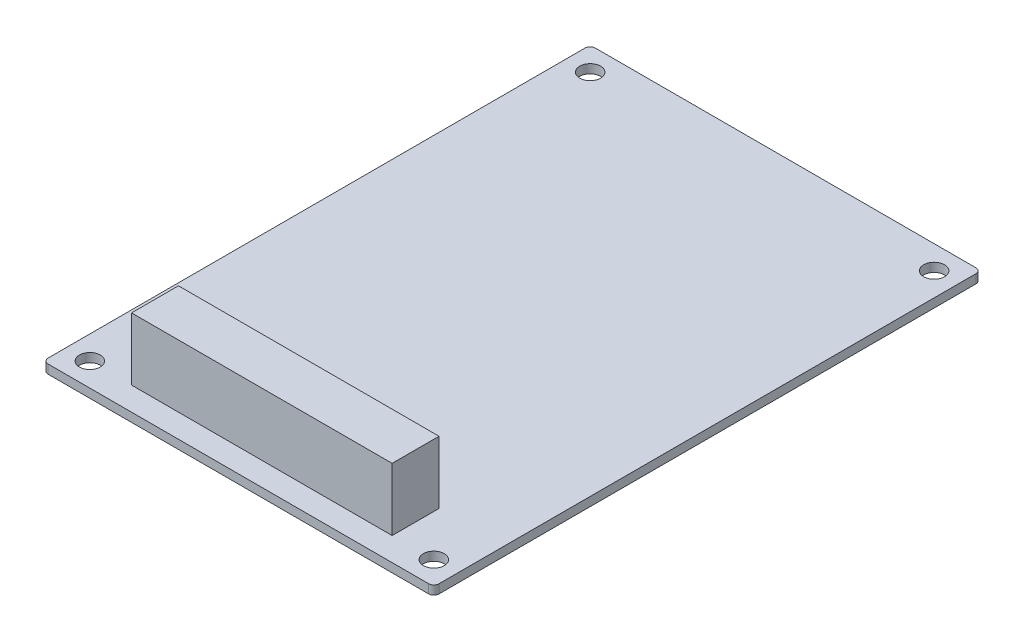
ISO-10303-21;
HEADER;
FILE_DESCRIPTION(('STEP AP214'),'2;1');
FILE_NAME('part.step','',(''),(''),'','','');
FILE_SCHEMA(('AUTOMOTIVE_DESIGN { 1 0 10303 214 1 1 1 1 }'));
ENDSEC;
DATA;
#1=APPLICATION_CONTEXT('core data for automotive mechanical design processes');
#2=APPLICATION_PROTOCOL_DEFINITION('international standard','automotive_design',2000,#1);
#3=PRODUCT_CONTEXT('',#1,'mechanical');
#4=PRODUCT('Part','Part','',(#3));
#5=PRODUCT_RELATED_PRODUCT_CATEGORY('part','',(#4));
#6=PRODUCT_DEFINITION_FORMATION('','',#4);
#7=PRODUCT_DEFINITION_CONTEXT('part definition',#1,'design');
#8=PRODUCT_DEFINITION('design','',#6,#7);
#9=PRODUCT_DEFINITION_SHAPE('','',#8);
#10=(LENGTH_UNIT() NAMED_UNIT(*) SI_UNIT(.MILLI.,.METRE.));
#11=(NAMED_UNIT(*) PLANE_ANGLE_UNIT() SI_UNIT($,.RADIAN.));
#12=(NAMED_UNIT(*) SI_UNIT($,.STERADIAN.) SOLID_ANGLE_UNIT());
#13=UNCERTAINTY_MEASURE_WITH_UNIT(LENGTH_MEASURE(1.E-05),#10,'distance_accuracy_value','');
#14=(GEOMETRIC_REPRESENTATION_CONTEXT(3) GLOBAL_UNCERTAINTY_ASSIGNED_CONTEXT((#13)) GLOBAL_UNIT_ASSIGNED_CONTEXT((#10,
#11,#12)) REPRESENTATION_CONTEXT('',''));
#15=CARTESIAN_POINT('',(0.,0.,0.));
#16=DIRECTION('',(0.,0.,1.));
#17=DIRECTION('',(1.,0.,0.));
#18=AXIS2_PLACEMENT_3D('',#15,#16,#17);
#19=CARTESIAN_POINT('',(0.,1.7,0.));
#20=DIRECTION('',(1.,0.,0.));
#21=DIRECTION('',(0.,0.,-1.));
#22=AXIS2_PLACEMENT_3D('',#19,#20,#21);
#23=PLANE('',#22);
#24=DIRECTION('',(0.,0.,1.));
#25=VECTOR('',#24,1.);
#26=CARTESIAN_POINT('',(0.,1.7,0.));
#27=LINE('',#26,#25);
#28=CARTESIAN_POINT('',(0.,1.7,1.));
#29=VERTEX_POINT('',#28);
#30=CARTESIAN_POINT('',(0.,1.7,104.));
#31=VERTEX_POINT('',#30);
#32=EDGE_CURVE('E226',#29,#31,#27,.T.);
#33=ORIENTED_EDGE('',*,*,#32,.F.);
#34=DIRECTION('',(0.,-1.,0.));
#35=VECTOR('',#34,1.);
#36=CARTESIAN_POINT('',(0.,1.7,1.));
#37=LINE('',#36,#35);
#38=CARTESIAN_POINT('',(0.,0.,1.));
#39=VERTEX_POINT('',#38);
#40=EDGE_CURVE('E251',#29,#39,#37,.T.);
#41=ORIENTED_EDGE('',*,*,#40,.T.);
#42=DIRECTION('',(0.,0.,1.));
#43=VECTOR('',#42,1.);
#44=CARTESIAN_POINT('',(0.,0.,0.));
#45=LINE('',#44,#43);
#46=CARTESIAN_POINT('',(0.,0.,104.));
#47=VERTEX_POINT('',#46);
#48=EDGE_CURVE('E225',#39,#47,#45,.T.);
#49=ORIENTED_EDGE('',*,*,#48,.T.);
#50=DIRECTION('',(0.,-1.,0.));
#51=VECTOR('',#50,1.);
#52=CARTESIAN_POINT('',(0.,1.7,104.));
#53=LINE('',#52,#51);
#54=EDGE_CURVE('E239',#47,#31,#53,.F.);
#55=ORIENTED_EDGE('',*,*,#54,.T.);
#56=EDGE_LOOP('',(#33,#41,#49,#55));
#57=FACE_BOUND('',#56,.T.);
#58=ADVANCED_FACE('F33',(#57),#23,.F.);
#59=CARTESIAN_POINT('',(0.,1.7,105.));
#60=DIRECTION('',(0.,0.,-1.));
#61=DIRECTION('',(-1.,0.,0.));
#62=AXIS2_PLACEMENT_3D('',#59,#60,#61);
#63=PLANE('',#62);
#64=DIRECTION('',(1.,0.,0.));
#65=VECTOR('',#64,1.);
#66=CARTESIAN_POINT('',(0.,1.7,105.));
#67=LINE('',#66,#65);
#68=CARTESIAN_POINT('',(1.00000000000003,1.7,105.));
#69=VERTEX_POINT('',#68);
#70=CARTESIAN_POINT('',(74.,1.7,105.));
#71=VERTEX_POINT('',#70);
#72=EDGE_CURVE('E229',#69,#71,#67,.T.);
#73=ORIENTED_EDGE('',*,*,#72,.F.);
#74=DIRECTION('',(0.,-1.,0.));
#75=VECTOR('',#74,1.);
#76=CARTESIAN_POINT('',(1.00000000000003,1.7,105.));
#77=LINE('',#76,#75);
#78=CARTESIAN_POINT('',(1.00000000000003,0.,105.));
#79=VERTEX_POINT('',#78);
#80=EDGE_CURVE('E282',#69,#79,#77,.T.);
#81=ORIENTED_EDGE('',*,*,#80,.T.);
#82=DIRECTION('',(1.,0.,0.));
#83=VECTOR('',#82,1.);
#84=CARTESIAN_POINT('',(0.,0.,105.));
#85=LINE('',#84,#83);
#86=CARTESIAN_POINT('',(74.,0.,105.));
#87=VERTEX_POINT('',#86);
#88=EDGE_CURVE('E242',#79,#87,#85,.T.);
#89=ORIENTED_EDGE('',*,*,#88,.T.);
#90=DIRECTION('',(0.,-1.,0.));
#91=VECTOR('',#90,1.);
#92=CARTESIAN_POINT('',(74.,1.7,105.));
#93=LINE('',#92,#91);
#94=EDGE_CURVE('E280',#87,#71,#93,.F.);
#95=ORIENTED_EDGE('',*,*,#94,.T.);
#96=EDGE_LOOP('',(#73,#81,#89,#95));
#97=FACE_BOUND('',#96,.T.);
#98=ADVANCED_FACE('F321',(#97),#63,.F.);
#99=CARTESIAN_POINT('',(75.,1.7,0.));
#100=DIRECTION('',(-1.,0.,0.));
#101=DIRECTION('',(0.,0.,1.));
#102=AXIS2_PLACEMENT_3D('',#99,#100,#101);
#103=PLANE('',#102);
#104=DIRECTION('',(0.,0.,-1.));
#105=VECTOR('',#104,1.);
#106=CARTESIAN_POINT('',(75.,0.,0.));
#107=LINE('',#106,#105);
#108=CARTESIAN_POINT('',(75.,0.,104.));
#109=VERTEX_POINT('',#108);
#110=CARTESIAN_POINT('',(75.,0.,1.));
#111=VERTEX_POINT('',#110);
#112=EDGE_CURVE('E245',#109,#111,#107,.T.);
#113=ORIENTED_EDGE('',*,*,#112,.T.);
#114=DIRECTION('',(0.,-1.,0.));
#115=VECTOR('',#114,1.);
#116=CARTESIAN_POINT('',(75.,1.7,1.));
#117=LINE('',#116,#115);
#118=CARTESIAN_POINT('',(75.,1.7,1.));
#119=VERTEX_POINT('',#118);
#120=EDGE_CURVE('E278',#111,#119,#117,.F.);
#121=ORIENTED_EDGE('',*,*,#120,.T.);
#122=DIRECTION('',(0.,0.,-1.));
#123=VECTOR('',#122,1.);
#124=CARTESIAN_POINT('',(75.,1.7,0.));
#125=LINE('',#124,#123);
#126=CARTESIAN_POINT('',(75.,1.7,104.));
#127=VERTEX_POINT('',#126);
#128=EDGE_CURVE('E233',#127,#119,#125,.T.);
#129=ORIENTED_EDGE('',*,*,#128,.F.);
#130=DIRECTION('',(0.,-1.,0.));
#131=VECTOR('',#130,1.);
#132=CARTESIAN_POINT('',(75.,1.7,104.));
#133=LINE('',#132,#131);
#134=EDGE_CURVE('E275',#127,#109,#133,.T.);
#135=ORIENTED_EDGE('',*,*,#134,.T.);
#136=EDGE_LOOP('',(#113,#121,#129,#135));
#137=FACE_BOUND('',#136,.T.);
#138=ADVANCED_FACE('F327',(#137),#103,.F.);
#139=CARTESIAN_POINT('',(0.,1.7,0.));
#140=DIRECTION('',(0.,0.,1.));
#141=DIRECTION('',(1.,0.,0.));
#142=AXIS2_PLACEMENT_3D('',#139,#140,#141);
#143=PLANE('',#142);
#144=DIRECTION('',(-1.,0.,0.));
#145=VECTOR('',#144,1.);
#146=CARTESIAN_POINT('',(0.,0.,0.));
#147=LINE('',#146,#145);
#148=CARTESIAN_POINT('',(74.,0.,0.));
#149=VERTEX_POINT('',#148);
#150=CARTESIAN_POINT('',(1.,0.,0.));
#151=VERTEX_POINT('',#150);
#152=EDGE_CURVE('E230',#149,#151,#147,.T.);
#153=ORIENTED_EDGE('',*,*,#152,.T.);
#154=DIRECTION('',(0.,-1.,0.));
#155=VECTOR('',#154,1.);
#156=CARTESIAN_POINT('',(1.,1.7,0.));
#157=LINE('',#156,#155);
#158=CARTESIAN_POINT('',(1.,1.7,0.));
#159=VERTEX_POINT('',#158);
#160=EDGE_CURVE('E265',#151,#159,#157,.F.);
#161=ORIENTED_EDGE('',*,*,#160,.T.);
#162=DIRECTION('',(-1.,0.,0.));
#163=VECTOR('',#162,1.);
#164=CARTESIAN_POINT('',(0.,1.7,0.));
#165=LINE('',#164,#163);
#166=CARTESIAN_POINT('',(74.,1.7,0.));
#167=VERTEX_POINT('',#166);
#168=EDGE_CURVE('E236',#167,#159,#165,.T.);
#169=ORIENTED_EDGE('',*,*,#168,.F.);
#170=DIRECTION('',(0.,-1.,0.));
#171=VECTOR('',#170,1.);
#172=CARTESIAN_POINT('',(74.,1.7,0.));
#173=LINE('',#172,#171);
#174=EDGE_CURVE('E262',#167,#149,#173,.T.);
#175=ORIENTED_EDGE('',*,*,#174,.T.);
#176=EDGE_LOOP('',(#153,#161,#169,#175));
#177=FACE_BOUND('',#176,.T.);
#178=ADVANCED_FACE('F367',(#177),#143,.F.);
#179=CARTESIAN_POINT('',(0.,1.7,0.));
#180=DIRECTION('',(0.,1.,0.));
#181=DIRECTION('',(0.,0.,1.));
#182=AXIS2_PLACEMENT_3D('',#179,#180,#181);
#183=PLANE('',#182);
#184=DIRECTION('',(0.,0.,1.));
#185=VECTOR('',#184,1.);
#186=CARTESIAN_POINT('',(12.5,1.7,0.));
#187=LINE('',#186,#185);
#188=CARTESIAN_POINT('',(12.5,1.7,91.5));
#189=VERTEX_POINT('',#188);
#190=CARTESIAN_POINT('',(12.5,1.7,100.5));
#191=VERTEX_POINT('',#190);
#192=EDGE_CURVE('E48',#189,#191,#187,.T.);
#193=ORIENTED_EDGE('',*,*,#192,.F.);
#194=DIRECTION('',(-1.,0.,0.));
#195=VECTOR('',#194,1.);
#196=CARTESIAN_POINT('',(0.,1.7,91.5));
#197=LINE('',#196,#195);
#198=CARTESIAN_POINT('',(62.5,1.7,91.5));
#199=VERTEX_POINT('',#198);
#200=EDGE_CURVE('E52',#199,#189,#197,.T.);
#201=ORIENTED_EDGE('',*,*,#200,.F.);
#202=DIRECTION('',(0.,0.,-1.));
#203=VECTOR('',#202,1.);
#204=CARTESIAN_POINT('',(62.5,1.7,0.));
#205=LINE('',#204,#203);
#206=CARTESIAN_POINT('',(62.5,1.7,100.5));
#207=VERTEX_POINT('',#206);
#208=EDGE_CURVE('E197',#207,#199,#205,.T.);
#209=ORIENTED_EDGE('',*,*,#208,.F.);
#210=DIRECTION('',(1.,0.,0.));
#211=VECTOR('',#210,1.);
#212=CARTESIAN_POINT('',(0.,1.7,100.5));
#213=LINE('',#212,#211);
#214=EDGE_CURVE('E187',#191,#207,#213,.T.);
#215=ORIENTED_EDGE('',*,*,#214,.F.);
#216=EDGE_LOOP('',(#193,#201,#209,#215));
#217=FACE_BOUND('',#216,.T.);
#218=CARTESIAN_POINT('',(70.5,1.7,100.5));
#219=DIRECTION('',(0.,1.,0.));
#220=DIRECTION('',(0.,0.,1.));
#221=AXIS2_PLACEMENT_3D('',#218,#219,#220);
#222=CIRCLE('',#221,1.99999999999999);
#223=CARTESIAN_POINT('',(70.5,1.7,102.5));
#224=VERTEX_POINT('',#223);
#225=EDGE_CURVE('E201',#224,#224,#222,.T.);
#226=ORIENTED_EDGE('',*,*,#225,.F.);
#227=EDGE_LOOP('',(#226));
#228=FACE_BOUND('',#227,.T.);
#229=CARTESIAN_POINT('',(4.5,1.7,100.5));
#230=DIRECTION('',(0.,1.,0.));
#231=DIRECTION('',(0.,0.,1.));
#232=AXIS2_PLACEMENT_3D('',#229,#230,#231);
#233=CIRCLE('',#232,1.99999999999999);
#234=CARTESIAN_POINT('',(4.5,1.7,102.5));
#235=VERTEX_POINT('',#234);
#236=EDGE_CURVE('E207',#235,#235,#233,.T.);
#237=ORIENTED_EDGE('',*,*,#236,.F.);
#238=EDGE_LOOP('',(#237));
#239=FACE_BOUND('',#238,.T.);
#240=CARTESIAN_POINT('',(70.5,1.7,4.49999999999999));
#241=DIRECTION('',(0.,1.,0.));
#242=DIRECTION('',(0.,0.,1.));
#243=AXIS2_PLACEMENT_3D('',#240,#241,#242);
#244=CIRCLE('',#243,1.99999999999999);
#245=CARTESIAN_POINT('',(70.5,1.7,6.49999999999998));
#246=VERTEX_POINT('',#245);
#247=EDGE_CURVE('E213',#246,#246,#244,.T.);
#248=ORIENTED_EDGE('',*,*,#247,.F.);
#249=EDGE_LOOP('',(#248));
#250=FACE_BOUND('',#249,.T.);
#251=CARTESIAN_POINT('',(4.5,1.7,4.49999999999999));
#252=DIRECTION('',(0.,1.,0.));
#253=DIRECTION('',(0.,0.,1.));
#254=AXIS2_PLACEMENT_3D('',#251,#252,#253);
#255=CIRCLE('',#254,1.99999999999999);
#256=CARTESIAN_POINT('',(4.5,1.7,6.49999999999998));
#257=VERTEX_POINT('',#256);
#258=EDGE_CURVE('E219',#257,#257,#255,.T.);
#259=ORIENTED_EDGE('',*,*,#258,.F.);
#260=EDGE_LOOP('',(#259));
#261=FACE_BOUND('',#260,.T.);
#262=ORIENTED_EDGE('',*,*,#168,.T.);
#263=CARTESIAN_POINT('',(1.,1.7,1.));
#264=DIRECTION('',(0.,1.,0.));
#265=DIRECTION('',(0.,0.,1.));
#266=AXIS2_PLACEMENT_3D('',#263,#264,#265);
#267=CIRCLE('',#266,1.);
#268=EDGE_CURVE('E273',#159,#29,#267,.T.);
#269=ORIENTED_EDGE('',*,*,#268,.T.);
#270=ORIENTED_EDGE('',*,*,#32,.T.);
#271=CARTESIAN_POINT('',(1.00000000000003,1.7,104.));
#272=DIRECTION('',(0.,1.,0.));
#273=DIRECTION('',(0.,0.,1.));
#274=AXIS2_PLACEMENT_3D('',#271,#272,#273);
#275=CIRCLE('',#274,1.);
#276=EDGE_CURVE('E269',#31,#69,#275,.T.);
#277=ORIENTED_EDGE('',*,*,#276,.T.);
#278=ORIENTED_EDGE('',*,*,#72,.T.);
#279=CARTESIAN_POINT('',(74.,1.7,104.));
#280=DIRECTION('',(0.,1.,0.));
#281=DIRECTION('',(0.,0.,1.));
#282=AXIS2_PLACEMENT_3D('',#279,#280,#281);
#283=CIRCLE('',#282,1.);
#284=EDGE_CURVE('E267',#71,#127,#283,.T.);
#285=ORIENTED_EDGE('',*,*,#284,.T.);
#286=ORIENTED_EDGE('',*,*,#128,.T.);
#287=CARTESIAN_POINT('',(74.,1.7,1.));
#288=DIRECTION('',(0.,1.,0.));
#289=DIRECTION('',(0.,0.,1.));
#290=AXIS2_PLACEMENT_3D('',#287,#288,#289);
#291=CIRCLE('',#290,1.);
#292=EDGE_CURVE('E271',#119,#167,#291,.T.);
#293=ORIENTED_EDGE('',*,*,#292,.T.);
#294=EDGE_LOOP('',(#262,#269,#270,#277,#278,#285,#286,#293));
#295=FACE_BOUND('',#294,.T.);
#296=ADVANCED_FACE('F353',(#217,#228,#239,#250,#261,#295),#183,.T.);
#297=CARTESIAN_POINT('',(0.,0.,0.));
#298=DIRECTION('',(0.,1.,0.));
#299=DIRECTION('',(0.,0.,1.));
#300=AXIS2_PLACEMENT_3D('',#297,#298,#299);
#301=PLANE('',#300);
#302=DIRECTION('',(-1.,0.,0.));
#303=VECTOR('',#302,1.);
#304=CARTESIAN_POINT('',(0.,0.,91.5));
#305=LINE('',#304,#303);
#306=CARTESIAN_POINT('',(62.5,0.,91.5));
#307=VERTEX_POINT('',#306);
#308=CARTESIAN_POINT('',(12.5,0.,91.5));
#309=VERTEX_POINT('',#308);
#310=EDGE_CURVE('E41',#307,#309,#305,.T.);
#311=ORIENTED_EDGE('',*,*,#310,.T.);
#312=DIRECTION('',(0.,0.,1.));
#313=VECTOR('',#312,1.);
#314=CARTESIAN_POINT('',(12.5,0.,0.));
#315=LINE('',#314,#313);
#316=CARTESIAN_POINT('',(12.5,0.,100.5));
#317=VERTEX_POINT('',#316);
#318=EDGE_CURVE('E11',#309,#317,#315,.T.);
#319=ORIENTED_EDGE('',*,*,#318,.T.);
#320=DIRECTION('',(1.,0.,0.));
#321=VECTOR('',#320,1.);
#322=CARTESIAN_POINT('',(0.,0.,100.5));
#323=LINE('',#322,#321);
#324=CARTESIAN_POINT('',(62.5,0.,100.5));
#325=VERTEX_POINT('',#324);
#326=EDGE_CURVE('E285',#317,#325,#323,.T.);
#327=ORIENTED_EDGE('',*,*,#326,.T.);
#328=DIRECTION('',(0.,0.,-1.));
#329=VECTOR('',#328,1.);
#330=CARTESIAN_POINT('',(62.5,0.,0.));
#331=LINE('',#330,#329);
#332=EDGE_CURVE('E288',#325,#307,#331,.T.);
#333=ORIENTED_EDGE('',*,*,#332,.T.);
#334=EDGE_LOOP('',(#311,#319,#327,#333));
#335=FACE_BOUND('',#334,.T.);
#336=CARTESIAN_POINT('',(70.5,0.,100.5));
#337=DIRECTION('',(0.,1.,0.));
#338=DIRECTION('',(0.,0.,1.));
#339=AXIS2_PLACEMENT_3D('',#336,#337,#338);
#340=CIRCLE('',#339,1.99999999999999);
#341=CARTESIAN_POINT('',(70.5,0.,102.5));
#342=VERTEX_POINT('',#341);
#343=EDGE_CURVE('E204',#342,#342,#340,.T.);
#344=ORIENTED_EDGE('',*,*,#343,.T.);
#345=EDGE_LOOP('',(#344));
#346=FACE_BOUND('',#345,.T.);
#347=CARTESIAN_POINT('',(4.5,0.,100.5));
#348=DIRECTION('',(0.,1.,0.));
#349=DIRECTION('',(0.,0.,1.));
#350=AXIS2_PLACEMENT_3D('',#347,#348,#349);
#351=CIRCLE('',#350,2.);
#352=CARTESIAN_POINT('',(4.5,0.,102.5));
#353=VERTEX_POINT('',#352);
#354=EDGE_CURVE('E210',#353,#353,#351,.T.);
#355=ORIENTED_EDGE('',*,*,#354,.T.);
#356=EDGE_LOOP('',(#355));
#357=FACE_BOUND('',#356,.T.);
#358=CARTESIAN_POINT('',(70.5,0.,4.49999999999999));
#359=DIRECTION('',(0.,1.,0.));
#360=DIRECTION('',(0.,0.,1.));
#361=AXIS2_PLACEMENT_3D('',#358,#359,#360);
#362=CIRCLE('',#361,1.99999999999999);
#363=CARTESIAN_POINT('',(70.5,0.,6.49999999999998));
#364=VERTEX_POINT('',#363);
#365=EDGE_CURVE('E216',#364,#364,#362,.T.);
#366=ORIENTED_EDGE('',*,*,#365,.T.);
#367=EDGE_LOOP('',(#366));
#368=FACE_BOUND('',#367,.T.);
#369=CARTESIAN_POINT('',(4.5,0.,4.49999999999999));
#370=DIRECTION('',(0.,1.,0.));
#371=DIRECTION('',(0.,0.,1.));
#372=AXIS2_PLACEMENT_3D('',#369,#370,#371);
#373=CIRCLE('',#372,2.);
#374=CARTESIAN_POINT('',(4.5,0.,6.49999999999999));
#375=VERTEX_POINT('',#374);
#376=EDGE_CURVE('E222',#375,#375,#373,.T.);
#377=ORIENTED_EDGE('',*,*,#376,.T.);
#378=EDGE_LOOP('',(#377));
#379=FACE_BOUND('',#378,.T.);
#380=ORIENTED_EDGE('',*,*,#48,.F.);
#381=CARTESIAN_POINT('',(1.,0.,1.));
#382=DIRECTION('',(0.,1.,0.));
#383=DIRECTION('',(0.,0.,1.));
#384=AXIS2_PLACEMENT_3D('',#381,#382,#383);
#385=CIRCLE('',#384,1.);
#386=EDGE_CURVE('E260',#39,#151,#385,.F.);
#387=ORIENTED_EDGE('',*,*,#386,.T.);
#388=ORIENTED_EDGE('',*,*,#152,.F.);
#389=CARTESIAN_POINT('',(74.,0.,1.));
#390=DIRECTION('',(0.,1.,0.));
#391=DIRECTION('',(0.,0.,1.));
#392=AXIS2_PLACEMENT_3D('',#389,#390,#391);
#393=CIRCLE('',#392,1.);
#394=EDGE_CURVE('E258',#149,#111,#393,.F.);
#395=ORIENTED_EDGE('',*,*,#394,.T.);
#396=ORIENTED_EDGE('',*,*,#112,.F.);
#397=CARTESIAN_POINT('',(74.,0.,104.));
#398=DIRECTION('',(0.,1.,0.));
#399=DIRECTION('',(0.,0.,1.));
#400=AXIS2_PLACEMENT_3D('',#397,#398,#399);
#401=CIRCLE('',#400,1.);
#402=EDGE_CURVE('E254',#109,#87,#401,.F.);
#403=ORIENTED_EDGE('',*,*,#402,.T.);
#404=ORIENTED_EDGE('',*,*,#88,.F.);
#405=CARTESIAN_POINT('',(1.00000000000003,0.,104.));
#406=DIRECTION('',(0.,1.,0.));
#407=DIRECTION('',(0.,0.,1.));
#408=AXIS2_PLACEMENT_3D('',#405,#406,#407);
#409=CIRCLE('',#408,1.);
#410=EDGE_CURVE('E256',#79,#47,#409,.F.);
#411=ORIENTED_EDGE('',*,*,#410,.T.);
#412=EDGE_LOOP('',(#380,#387,#388,#395,#396,#403,#404,#411));
#413=FACE_BOUND('',#412,.T.);
#414=ADVANCED_FACE('F292',(#335,#346,#357,#368,#379,#413),#301,.F.);
#415=CARTESIAN_POINT('',(4.5,1.7,4.49999999999999));
#416=DIRECTION('',(0.,1.,0.));
#417=DIRECTION('',(0.,0.,1.));
#418=AXIS2_PLACEMENT_3D('',#415,#416,#417);
#419=CYLINDRICAL_SURFACE('',#418,2.);
#420=ORIENTED_EDGE('',*,*,#376,.F.);
#421=EDGE_LOOP('',(#420));
#422=FACE_BOUND('',#421,.T.);
#423=ORIENTED_EDGE('',*,*,#258,.T.);
#424=EDGE_LOOP('',(#423));
#425=FACE_BOUND('',#424,.T.);
#426=ADVANCED_FACE('F374',(#422,#425),#419,.F.);
#427=CARTESIAN_POINT('',(70.5,1.7,4.49999999999999));
#428=DIRECTION('',(0.,1.,0.));
#429=DIRECTION('',(0.,0.,1.));
#430=AXIS2_PLACEMENT_3D('',#427,#428,#429);
#431=CYLINDRICAL_SURFACE('',#430,1.99999999999999);
#432=ORIENTED_EDGE('',*,*,#365,.F.);
#433=EDGE_LOOP('',(#432));
#434=FACE_BOUND('',#433,.T.);
#435=ORIENTED_EDGE('',*,*,#247,.T.);
#436=EDGE_LOOP('',(#435));
#437=FACE_BOUND('',#436,.T.);
#438=ADVANCED_FACE('F380',(#434,#437),#431,.F.);
#439=CARTESIAN_POINT('',(4.5,1.7,100.5));
#440=DIRECTION('',(0.,1.,0.));
#441=DIRECTION('',(0.,0.,1.));
#442=AXIS2_PLACEMENT_3D('',#439,#440,#441);
#443=CYLINDRICAL_SURFACE('',#442,2.);
#444=ORIENTED_EDGE('',*,*,#354,.F.);
#445=EDGE_LOOP('',(#444));
#446=FACE_BOUND('',#445,.T.);
#447=ORIENTED_EDGE('',*,*,#236,.T.);
#448=EDGE_LOOP('',(#447));
#449=FACE_BOUND('',#448,.T.);
#450=ADVANCED_FACE('F493',(#446,#449),#443,.F.);
#451=CARTESIAN_POINT('',(70.5,1.7,100.5));
#452=DIRECTION('',(0.,1.,0.));
#453=DIRECTION('',(0.,0.,1.));
#454=AXIS2_PLACEMENT_3D('',#451,#452,#453);
#455=CYLINDRICAL_SURFACE('',#454,1.99999999999999);
#456=ORIENTED_EDGE('',*,*,#343,.F.);
#457=EDGE_LOOP('',(#456));
#458=FACE_BOUND('',#457,.T.);
#459=ORIENTED_EDGE('',*,*,#225,.T.);
#460=EDGE_LOOP('',(#459));
#461=FACE_BOUND('',#460,.T.);
#462=ADVANCED_FACE('F337',(#458,#461),#455,.F.);
#463=CARTESIAN_POINT('',(1.,1.7,1.));
#464=DIRECTION('',(0.,-1.,0.));
#465=DIRECTION('',(0.,0.,-1.));
#466=AXIS2_PLACEMENT_3D('',#463,#464,#465);
#467=CYLINDRICAL_SURFACE('',#466,1.);
#468=ORIENTED_EDGE('',*,*,#268,.F.);
#469=ORIENTED_EDGE('',*,*,#160,.F.);
#470=ORIENTED_EDGE('',*,*,#386,.F.);
#471=ORIENTED_EDGE('',*,*,#40,.F.);
#472=EDGE_LOOP('',(#468,#469,#470,#471));
#473=FACE_BOUND('',#472,.T.);
#474=ADVANCED_FACE('F333',(#473),#467,.T.);
#475=CARTESIAN_POINT('',(74.,1.7,1.));
#476=DIRECTION('',(0.,-1.,0.));
#477=DIRECTION('',(0.,0.,-1.));
#478=AXIS2_PLACEMENT_3D('',#475,#476,#477);
#479=CYLINDRICAL_SURFACE('',#478,1.);
#480=ORIENTED_EDGE('',*,*,#292,.F.);
#481=ORIENTED_EDGE('',*,*,#120,.F.);
#482=ORIENTED_EDGE('',*,*,#394,.F.);
#483=ORIENTED_EDGE('',*,*,#174,.F.);
#484=EDGE_LOOP('',(#480,#481,#482,#483));
#485=FACE_BOUND('',#484,.T.);
#486=ADVANCED_FACE('F336',(#485),#479,.T.);
#487=CARTESIAN_POINT('',(1.00000000000003,1.7,104.));
#488=DIRECTION('',(0.,-1.,0.));
#489=DIRECTION('',(0.,0.,-1.));
#490=AXIS2_PLACEMENT_3D('',#487,#488,#489);
#491=CYLINDRICAL_SURFACE('',#490,1.);
#492=ORIENTED_EDGE('',*,*,#276,.F.);
#493=ORIENTED_EDGE('',*,*,#54,.F.);
#494=ORIENTED_EDGE('',*,*,#410,.F.);
#495=ORIENTED_EDGE('',*,*,#80,.F.);
#496=EDGE_LOOP('',(#492,#493,#494,#495));
#497=FACE_BOUND('',#496,.T.);
#498=ADVANCED_FACE('F340',(#497),#491,.T.);
#499=CARTESIAN_POINT('',(74.,1.7,104.));
#500=DIRECTION('',(0.,-1.,0.));
#501=DIRECTION('',(0.,0.,-1.));
#502=AXIS2_PLACEMENT_3D('',#499,#500,#501);
#503=CYLINDRICAL_SURFACE('',#502,1.);
#504=ORIENTED_EDGE('',*,*,#284,.F.);
#505=ORIENTED_EDGE('',*,*,#94,.F.);
#506=ORIENTED_EDGE('',*,*,#402,.F.);
#507=ORIENTED_EDGE('',*,*,#134,.F.);
#508=EDGE_LOOP('',(#504,#505,#506,#507));
#509=FACE_BOUND('',#508,.T.);
#510=ADVANCED_FACE('F35',(#509),#503,.T.);
#511=CARTESIAN_POINT('',(0.,-3.3,0.));
#512=DIRECTION('',(0.,1.,0.));
#513=DIRECTION('',(0.,0.,1.));
#514=AXIS2_PLACEMENT_3D('',#511,#512,#513);
#515=PLANE('',#514);
#516=DIRECTION('',(0.,0.,1.));
#517=VECTOR('',#516,1.);
#518=CARTESIAN_POINT('',(12.5,-3.3,91.5));
#519=LINE('',#518,#517);
#520=CARTESIAN_POINT('',(12.5,-3.3,91.5));
#521=VERTEX_POINT('',#520);
#522=CARTESIAN_POINT('',(12.5,-3.3,100.5));
#523=VERTEX_POINT('',#522);
#524=EDGE_CURVE('E173',#521,#523,#519,.T.);
#525=ORIENTED_EDGE('',*,*,#524,.F.);
#526=DIRECTION('',(-1.,0.,0.));
#527=VECTOR('',#526,1.);
#528=CARTESIAN_POINT('',(12.5,-3.3,91.5));
#529=LINE('',#528,#527);
#530=CARTESIAN_POINT('',(62.5,-3.3,91.5));
#531=VERTEX_POINT('',#530);
#532=EDGE_CURVE('E153',#531,#521,#529,.T.);
#533=ORIENTED_EDGE('',*,*,#532,.F.);
#534=DIRECTION('',(0.,0.,-1.));
#535=VECTOR('',#534,1.);
#536=CARTESIAN_POINT('',(62.5,-3.3,91.5));
#537=LINE('',#536,#535);
#538=CARTESIAN_POINT('',(62.5,-3.3,100.5));
#539=VERTEX_POINT('',#538);
#540=EDGE_CURVE('E179',#539,#531,#537,.T.);
#541=ORIENTED_EDGE('',*,*,#540,.F.);
#542=DIRECTION('',(1.,0.,0.));
#543=VECTOR('',#542,1.);
#544=CARTESIAN_POINT('',(12.5,-3.3,100.5));
#545=LINE('',#544,#543);
#546=EDGE_CURVE('E176',#523,#539,#545,.T.);
#547=ORIENTED_EDGE('',*,*,#546,.F.);
#548=EDGE_LOOP('',(#525,#533,#541,#547));
#549=FACE_BOUND('',#548,.T.);
#550=ADVANCED_FACE('F304',(#549),#515,.F.);
#551=CARTESIAN_POINT('',(12.5,-3.3,100.5));
#552=DIRECTION('',(0.,0.,1.));
#553=DIRECTION('',(1.,0.,0.));
#554=AXIS2_PLACEMENT_3D('',#551,#552,#553);
#555=PLANE('',#554);
#556=ORIENTED_EDGE('',*,*,#326,.F.);
#557=DIRECTION('',(0.,1.,0.));
#558=VECTOR('',#557,1.);
#559=CARTESIAN_POINT('',(12.5,-3.3,100.5));
#560=LINE('',#559,#558);
#561=EDGE_CURVE('E152',#523,#317,#560,.T.);
#562=ORIENTED_EDGE('',*,*,#561,.F.);
#563=ORIENTED_EDGE('',*,*,#546,.T.);
#564=DIRECTION('',(0.,1.,0.));
#565=VECTOR('',#564,1.);
#566=CARTESIAN_POINT('',(62.5,-3.3,100.5));
#567=LINE('',#566,#565);
#568=EDGE_CURVE('E193',#539,#325,#567,.T.);
#569=ORIENTED_EDGE('',*,*,#568,.T.);
#570=EDGE_LOOP('',(#556,#562,#563,#569));
#571=FACE_BOUND('',#570,.T.);
#572=ADVANCED_FACE('F308',(#571),#555,.T.);
#573=CARTESIAN_POINT('',(62.5,-3.3,91.5));
#574=DIRECTION('',(1.,0.,0.));
#575=DIRECTION('',(0.,0.,-1.));
#576=AXIS2_PLACEMENT_3D('',#573,#574,#575);
#577=PLANE('',#576);
#578=ORIENTED_EDGE('',*,*,#332,.F.);
#579=ORIENTED_EDGE('',*,*,#568,.F.);
#580=ORIENTED_EDGE('',*,*,#540,.T.);
#581=DIRECTION('',(0.,1.,0.));
#582=VECTOR('',#581,1.);
#583=CARTESIAN_POINT('',(62.5,-3.3,91.5));
#584=LINE('',#583,#582);
#585=EDGE_CURVE('E189',#531,#307,#584,.T.);
#586=ORIENTED_EDGE('',*,*,#585,.T.);
#587=EDGE_LOOP('',(#578,#579,#580,#586));
#588=FACE_BOUND('',#587,.T.);
#589=ADVANCED_FACE('F298',(#588),#577,.T.);
#590=CARTESIAN_POINT('',(12.5,-3.3,91.5));
#591=DIRECTION('',(0.,0.,-1.));
#592=DIRECTION('',(-1.,0.,0.));
#593=AXIS2_PLACEMENT_3D('',#590,#591,#592);
#594=PLANE('',#593);
#595=ORIENTED_EDGE('',*,*,#310,.F.);
#596=ORIENTED_EDGE('',*,*,#585,.F.);
#597=ORIENTED_EDGE('',*,*,#532,.T.);
#598=DIRECTION('',(0.,1.,0.));
#599=VECTOR('',#598,1.);
#600=CARTESIAN_POINT('',(12.5,-3.3,91.5));
#601=LINE('',#600,#599);
#602=EDGE_CURVE('E184',#521,#309,#601,.T.);
#603=ORIENTED_EDGE('',*,*,#602,.T.);
#604=EDGE_LOOP('',(#595,#596,#597,#603));
#605=FACE_BOUND('',#604,.T.);
#606=ADVANCED_FACE('F296',(#605),#594,.T.);
#607=CARTESIAN_POINT('',(12.5,-3.3,91.5));
#608=DIRECTION('',(-1.,0.,0.));
#609=DIRECTION('',(0.,0.,1.));
#610=AXIS2_PLACEMENT_3D('',#607,#608,#609);
#611=PLANE('',#610);
#612=ORIENTED_EDGE('',*,*,#318,.F.);
#613=ORIENTED_EDGE('',*,*,#602,.F.);
#614=ORIENTED_EDGE('',*,*,#524,.T.);
#615=ORIENTED_EDGE('',*,*,#561,.T.);
#616=EDGE_LOOP('',(#612,#613,#614,#615));
#617=FACE_BOUND('',#616,.T.);
#618=ADVANCED_FACE('F306',(#617),#611,.T.);
#619=CARTESIAN_POINT('',(12.5,13.7,91.5));
#620=VERTEX_POINT('',#619);
#621=EDGE_CURVE('E188',#189,#620,#601,.T.);
#622=ORIENTED_EDGE('',*,*,#621,.F.);
#623=ORIENTED_EDGE('',*,*,#192,.T.);
#624=CARTESIAN_POINT('',(12.5,13.7,100.5));
#625=VERTEX_POINT('',#624);
#626=EDGE_CURVE('E144',#191,#625,#560,.T.);
#627=ORIENTED_EDGE('',*,*,#626,.T.);
#628=DIRECTION('',(0.,0.,1.));
#629=VECTOR('',#628,1.);
#630=CARTESIAN_POINT('',(12.5,13.7,91.5));
#631=LINE('',#630,#629);
#632=EDGE_CURVE('E149',#620,#625,#631,.T.);
#633=ORIENTED_EDGE('',*,*,#632,.F.);
#634=EDGE_LOOP('',(#622,#623,#627,#633));
#635=FACE_BOUND('',#634,.T.);
#636=ADVANCED_FACE('F147',(#635),#611,.T.);
#637=CARTESIAN_POINT('',(62.5,13.7,91.5));
#638=VERTEX_POINT('',#637);
#639=EDGE_CURVE('E192',#199,#638,#584,.T.);
#640=ORIENTED_EDGE('',*,*,#639,.F.);
#641=ORIENTED_EDGE('',*,*,#200,.T.);
#642=ORIENTED_EDGE('',*,*,#621,.T.);
#643=DIRECTION('',(-1.,0.,0.));
#644=VECTOR('',#643,1.);
#645=CARTESIAN_POINT('',(12.5,13.7,91.5));
#646=LINE('',#645,#644);
#647=EDGE_CURVE('E168',#638,#620,#646,.T.);
#648=ORIENTED_EDGE('',*,*,#647,.F.);
#649=EDGE_LOOP('',(#640,#641,#642,#648));
#650=FACE_BOUND('',#649,.T.);
#651=ADVANCED_FACE('F434',(#650),#594,.T.);
#652=CARTESIAN_POINT('',(62.5,13.7,100.5));
#653=VERTEX_POINT('',#652);
#654=EDGE_CURVE('E159',#207,#653,#567,.T.);
#655=ORIENTED_EDGE('',*,*,#654,.F.);
#656=ORIENTED_EDGE('',*,*,#208,.T.);
#657=ORIENTED_EDGE('',*,*,#639,.T.);
#658=DIRECTION('',(0.,0.,-1.));
#659=VECTOR('',#658,1.);
#660=CARTESIAN_POINT('',(62.5,13.7,91.5));
#661=LINE('',#660,#659);
#662=EDGE_CURVE('E163',#653,#638,#661,.T.);
#663=ORIENTED_EDGE('',*,*,#662,.F.);
#664=EDGE_LOOP('',(#655,#656,#657,#663));
#665=FACE_BOUND('',#664,.T.);
#666=ADVANCED_FACE('F316',(#665),#577,.T.);
#667=ORIENTED_EDGE('',*,*,#626,.F.);
#668=ORIENTED_EDGE('',*,*,#214,.T.);
#669=ORIENTED_EDGE('',*,*,#654,.T.);
#670=DIRECTION('',(1.,0.,0.));
#671=VECTOR('',#670,1.);
#672=CARTESIAN_POINT('',(12.5,13.7,100.5));
#673=LINE('',#672,#671);
#674=EDGE_CURVE('E156',#625,#653,#673,.T.);
#675=ORIENTED_EDGE('',*,*,#674,.F.);
#676=EDGE_LOOP('',(#667,#668,#669,#675));
#677=FACE_BOUND('',#676,.T.);
#678=ADVANCED_FACE('F157',(#677),#555,.T.);
#679=CARTESIAN_POINT('',(0.,13.7,0.));
#680=DIRECTION('',(0.,1.,0.));
#681=DIRECTION('',(0.,0.,1.));
#682=AXIS2_PLACEMENT_3D('',#679,#680,#681);
#683=PLANE('',#682);
#684=ORIENTED_EDGE('',*,*,#632,.T.);
#685=ORIENTED_EDGE('',*,*,#674,.T.);
#686=ORIENTED_EDGE('',*,*,#662,.T.);
#687=ORIENTED_EDGE('',*,*,#647,.T.);
#688=EDGE_LOOP('',(#684,#685,#686,#687));
#689=FACE_BOUND('',#688,.T.);
#690=ADVANCED_FACE('F166',(#689),#683,.T.);
#691=CLOSED_SHELL('',(#58,#98,#138,#178,#296,#414,#426,#438,#450,#462,#474,#486,#498,#510,#550,
#572,#589,#606,#618,#636,#651,#666,#678,#690));
#692=MANIFOLD_SOLID_BREP('B2',#691);
#693=ADVANCED_BREP_SHAPE_REPRESENTATION('',(#18,#692),#14);
#694=SHAPE_DEFINITION_REPRESENTATION(#9,#693);
ENDSEC;
END-ISO-10303-21;
